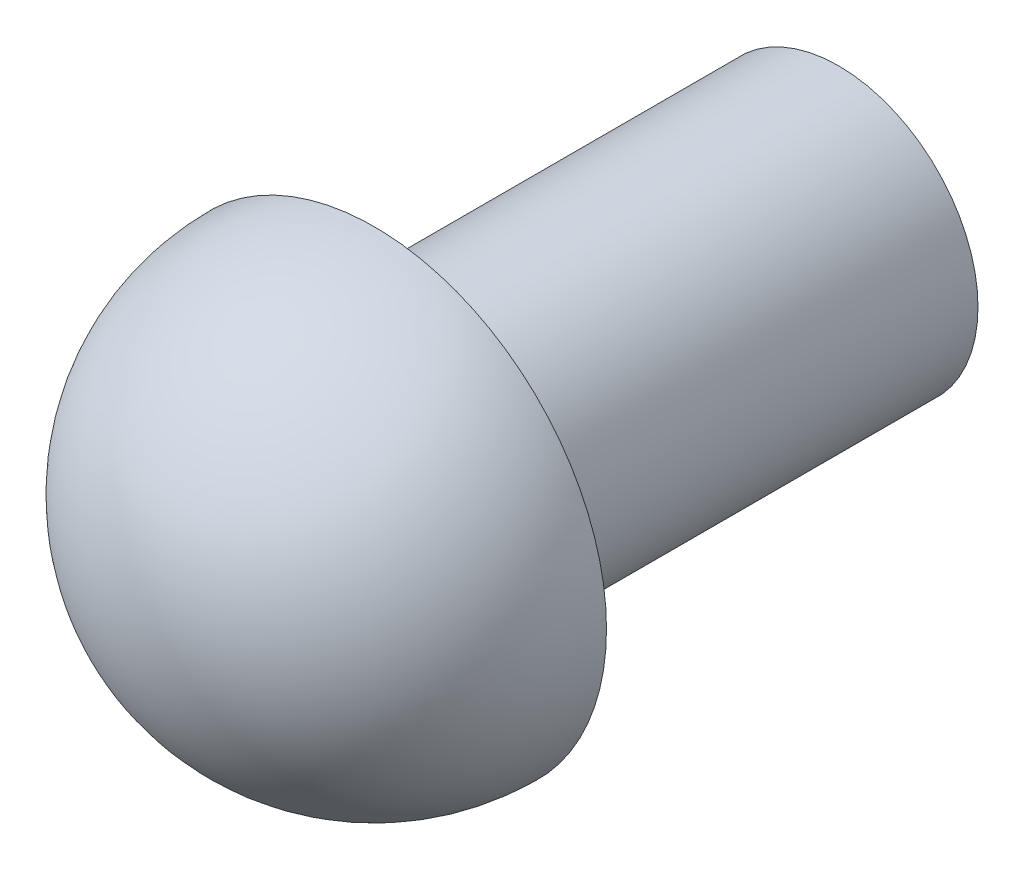
ISO-10303-21;
HEADER;
FILE_DESCRIPTION(('STEP AP214'),'2;1');
FILE_NAME('part.step','',(''),(''),'','','');
FILE_SCHEMA(('AUTOMOTIVE_DESIGN { 1 0 10303 214 1 1 1 1 }'));
ENDSEC;
DATA;
#1=APPLICATION_CONTEXT('core data for automotive mechanical design processes');
#2=APPLICATION_PROTOCOL_DEFINITION('international standard','automotive_design',2000,#1);
#3=PRODUCT_CONTEXT('',#1,'mechanical');
#4=PRODUCT('Part','Part','',(#3));
#5=PRODUCT_RELATED_PRODUCT_CATEGORY('part','',(#4));
#6=PRODUCT_DEFINITION_FORMATION('','',#4);
#7=PRODUCT_DEFINITION_CONTEXT('part definition',#1,'design');
#8=PRODUCT_DEFINITION('design','',#6,#7);
#9=PRODUCT_DEFINITION_SHAPE('','',#8);
#10=(LENGTH_UNIT() NAMED_UNIT(*) SI_UNIT(.MILLI.,.METRE.));
#11=(NAMED_UNIT(*) PLANE_ANGLE_UNIT() SI_UNIT($,.RADIAN.));
#12=(NAMED_UNIT(*) SI_UNIT($,.STERADIAN.) SOLID_ANGLE_UNIT());
#13=UNCERTAINTY_MEASURE_WITH_UNIT(LENGTH_MEASURE(1.E-05),#10,'distance_accuracy_value','');
#14=(GEOMETRIC_REPRESENTATION_CONTEXT(3) GLOBAL_UNCERTAINTY_ASSIGNED_CONTEXT((#13)) GLOBAL_UNIT_ASSIGNED_CONTEXT((#10,
#11,#12)) REPRESENTATION_CONTEXT('',''));
#15=CARTESIAN_POINT('',(0.,0.,0.));
#16=DIRECTION('',(0.,0.,1.));
#17=DIRECTION('',(1.,0.,0.));
#18=AXIS2_PLACEMENT_3D('',#15,#16,#17);
#19=CARTESIAN_POINT('',(0.,5.,0.));
#20=DIRECTION('',(0.,-1.,0.));
#21=DIRECTION('',(1.,0.,0.));
#22=AXIS2_PLACEMENT_3D('',#19,#20,#21);
#23=SPHERICAL_SURFACE('',#22,5.);
#24=CARTESIAN_POINT('',(0.,5.,0.));
#25=DIRECTION('',(0.,0.,-1.));
#26=DIRECTION('',(-1.,0.,0.));
#27=AXIS2_PLACEMENT_3D('',#24,#25,#26);
#28=SPHERICAL_SURFACE('',#27,5.);
#29=CARTESIAN_POINT('',(0.,5.,0.));
#30=DIRECTION('',(0.,0.,-1.));
#31=DIRECTION('',(-1.,0.,0.));
#32=AXIS2_PLACEMENT_3D('',#29,#30,#31);
#33=CIRCLE('',#32,5.);
#34=CARTESIAN_POINT('',(-5.,5.,0.));
#35=VERTEX_POINT('',#34);
#36=EDGE_CURVE('E10',#35,#35,#33,.T.);
#37=ORIENTED_EDGE('',*,*,#36,.F.);
#38=EDGE_LOOP('',(#37));
#39=FACE_BOUND('',#38,.T.);
#40=ADVANCED_FACE('F37',(#39),#28,.T.);
#41=CARTESIAN_POINT('',(0.,0.,0.));
#42=DIRECTION('',(0.,0.,-1.));
#43=DIRECTION('',(-1.,0.,0.));
#44=AXIS2_PLACEMENT_3D('',#41,#42,#43);
#45=PLANE('',#44);
#46=CARTESIAN_POINT('',(0.,5.,0.));
#47=DIRECTION('',(0.,0.,-1.));
#48=DIRECTION('',(-1.,0.,0.));
#49=AXIS2_PLACEMENT_3D('',#46,#47,#48);
#50=CIRCLE('',#49,3.);
#51=CARTESIAN_POINT('',(-3.,5.,0.));
#52=VERTEX_POINT('',#51);
#53=EDGE_CURVE('E47',#52,#52,#50,.T.);
#54=ORIENTED_EDGE('',*,*,#53,.F.);
#55=EDGE_LOOP('',(#54));
#56=FACE_BOUND('',#55,.T.);
#57=ORIENTED_EDGE('',*,*,#36,.T.);
#58=EDGE_LOOP('',(#57));
#59=FACE_BOUND('',#58,.T.);
#60=ADVANCED_FACE('F56',(#56,#59),#45,.T.);
#61=CARTESIAN_POINT('',(0.,5.,-10.));
#62=DIRECTION('',(0.,0.,1.));
#63=DIRECTION('',(1.,0.,0.));
#64=AXIS2_PLACEMENT_3D('',#61,#62,#63);
#65=CYLINDRICAL_SURFACE('',#64,3.);
#66=CARTESIAN_POINT('',(0.,5.,-10.));
#67=DIRECTION('',(0.,0.,-1.));
#68=DIRECTION('',(-1.,0.,0.));
#69=AXIS2_PLACEMENT_3D('',#66,#67,#68);
#70=CIRCLE('',#69,3.);
#71=CARTESIAN_POINT('',(-3.00000000000007,5.,-9.99999999999998));
#72=VERTEX_POINT('',#71);
#73=EDGE_CURVE('E43',#72,#72,#70,.T.);
#74=ORIENTED_EDGE('',*,*,#73,.F.);
#75=EDGE_LOOP('',(#74));
#76=FACE_BOUND('',#75,.T.);
#77=ORIENTED_EDGE('',*,*,#53,.T.);
#78=EDGE_LOOP('',(#77));
#79=FACE_BOUND('',#78,.T.);
#80=ADVANCED_FACE('F54',(#76,#79),#65,.T.);
#81=CARTESIAN_POINT('',(0.,0.,-10.));
#82=DIRECTION('',(0.,0.,-1.));
#83=DIRECTION('',(-1.,0.,0.));
#84=AXIS2_PLACEMENT_3D('',#81,#82,#83);
#85=PLANE('',#84);
#86=ORIENTED_EDGE('',*,*,#73,.T.);
#87=EDGE_LOOP('',(#86));
#88=FACE_BOUND('',#87,.T.);
#89=ADVANCED_FACE('F62',(#88),#85,.T.);
#90=CLOSED_SHELL('',(#40,#60,#80,#89));
#91=MANIFOLD_SOLID_BREP('B2',#90);
#92=ADVANCED_BREP_SHAPE_REPRESENTATION('',(#18,#91),#14);
#93=SHAPE_DEFINITION_REPRESENTATION(#9,#92);
ENDSEC;
END-ISO-10303-21;
